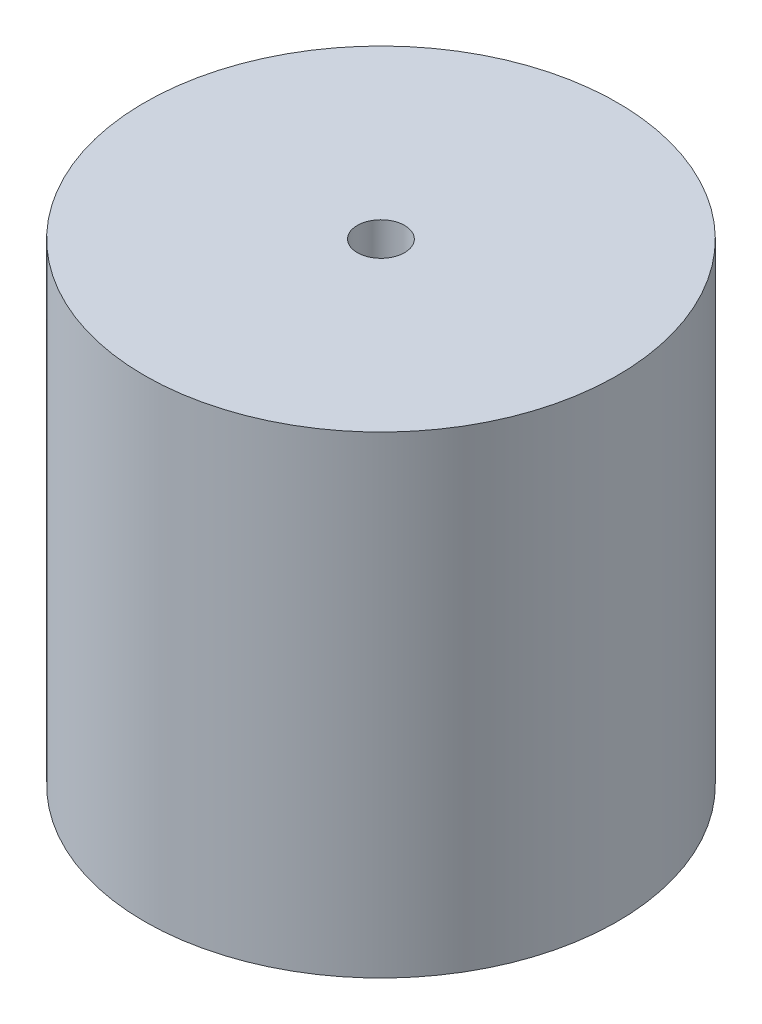
ISO-10303-21;
HEADER;
FILE_DESCRIPTION(('STEP AP214'),'2;1');
FILE_NAME('part.step','',(''),(''),'','','');
FILE_SCHEMA(('AUTOMOTIVE_DESIGN { 1 0 10303 214 1 1 1 1 }'));
ENDSEC;
DATA;
#1=APPLICATION_CONTEXT('core data for automotive mechanical design processes');
#2=APPLICATION_PROTOCOL_DEFINITION('international standard','automotive_design',2000,#1);
#3=PRODUCT_CONTEXT('',#1,'mechanical');
#4=PRODUCT('Part','Part','',(#3));
#5=PRODUCT_RELATED_PRODUCT_CATEGORY('part','',(#4));
#6=PRODUCT_DEFINITION_FORMATION('','',#4);
#7=PRODUCT_DEFINITION_CONTEXT('part definition',#1,'design');
#8=PRODUCT_DEFINITION('design','',#6,#7);
#9=PRODUCT_DEFINITION_SHAPE('','',#8);
#10=(LENGTH_UNIT() NAMED_UNIT(*) SI_UNIT(.MILLI.,.METRE.));
#11=(NAMED_UNIT(*) PLANE_ANGLE_UNIT() SI_UNIT($,.RADIAN.));
#12=(NAMED_UNIT(*) SI_UNIT($,.STERADIAN.) SOLID_ANGLE_UNIT());
#13=UNCERTAINTY_MEASURE_WITH_UNIT(LENGTH_MEASURE(1.E-05),#10,'distance_accuracy_value','');
#14=(GEOMETRIC_REPRESENTATION_CONTEXT(3) GLOBAL_UNCERTAINTY_ASSIGNED_CONTEXT((#13)) GLOBAL_UNIT_ASSIGNED_CONTEXT((#10,
#11,#12)) REPRESENTATION_CONTEXT('',''));
#15=CARTESIAN_POINT('',(0.,0.,0.));
#16=DIRECTION('',(0.,0.,1.));
#17=DIRECTION('',(1.,0.,0.));
#18=AXIS2_PLACEMENT_3D('',#15,#16,#17);
#19=CARTESIAN_POINT('',(0.,31.75,0.));
#20=DIRECTION('',(0.,-1.,0.));
#21=DIRECTION('',(0.,0.,-1.));
#22=AXIS2_PLACEMENT_3D('',#19,#20,#21);
#23=CYLINDRICAL_SURFACE('',#22,15.875);
#24=CARTESIAN_POINT('',(0.,31.75,0.));
#25=DIRECTION('',(0.,1.,0.));
#26=DIRECTION('',(0.,0.,1.));
#27=AXIS2_PLACEMENT_3D('',#24,#25,#26);
#28=CIRCLE('',#27,15.875);
#29=CARTESIAN_POINT('',(0.,31.75,15.875));
#30=VERTEX_POINT('',#29);
#31=EDGE_CURVE('E10',#30,#30,#28,.T.);
#32=ORIENTED_EDGE('',*,*,#31,.F.);
#33=EDGE_LOOP('',(#32));
#34=FACE_BOUND('',#33,.T.);
#35=CARTESIAN_POINT('',(0.,0.,0.));
#36=DIRECTION('',(0.,1.,0.));
#37=DIRECTION('',(0.,0.,1.));
#38=AXIS2_PLACEMENT_3D('',#35,#36,#37);
#39=CIRCLE('',#38,15.875);
#40=CARTESIAN_POINT('',(0.,0.,15.875));
#41=VERTEX_POINT('',#40);
#42=EDGE_CURVE('E34',#41,#41,#39,.T.);
#43=ORIENTED_EDGE('',*,*,#42,.T.);
#44=EDGE_LOOP('',(#43));
#45=FACE_BOUND('',#44,.T.);
#46=ADVANCED_FACE('F31',(#34,#45),#23,.T.);
#47=CARTESIAN_POINT('',(0.,31.75,0.));
#48=DIRECTION('',(0.,1.,0.));
#49=DIRECTION('',(0.,0.,1.));
#50=AXIS2_PLACEMENT_3D('',#47,#48,#49);
#51=PLANE('',#50);
#52=CARTESIAN_POINT('',(0.,31.75,0.));
#53=DIRECTION('',(0.,1.,0.));
#54=DIRECTION('',(0.,0.,1.));
#55=AXIS2_PLACEMENT_3D('',#52,#53,#54);
#56=CIRCLE('',#55,1.5875);
#57=CARTESIAN_POINT('',(0.,31.75,1.5875));
#58=VERTEX_POINT('',#57);
#59=EDGE_CURVE('E46',#58,#58,#56,.T.);
#60=ORIENTED_EDGE('',*,*,#59,.F.);
#61=EDGE_LOOP('',(#60));
#62=FACE_BOUND('',#61,.T.);
#63=ORIENTED_EDGE('',*,*,#31,.T.);
#64=EDGE_LOOP('',(#63));
#65=FACE_BOUND('',#64,.T.);
#66=ADVANCED_FACE('F57',(#62,#65),#51,.T.);
#67=CARTESIAN_POINT('',(0.,0.,0.));
#68=DIRECTION('',(0.,1.,0.));
#69=DIRECTION('',(0.,0.,1.));
#70=AXIS2_PLACEMENT_3D('',#67,#68,#69);
#71=PLANE('',#70);
#72=CARTESIAN_POINT('',(0.,0.,0.));
#73=DIRECTION('',(0.,-1.,0.));
#74=DIRECTION('',(0.,0.,-1.));
#75=AXIS2_PLACEMENT_3D('',#72,#73,#74);
#76=CIRCLE('',#75,12.065);
#77=CARTESIAN_POINT('',(0.,0.,-12.065));
#78=VERTEX_POINT('',#77);
#79=EDGE_CURVE('E43',#78,#78,#76,.T.);
#80=ORIENTED_EDGE('',*,*,#79,.F.);
#81=EDGE_LOOP('',(#80));
#82=FACE_BOUND('',#81,.T.);
#83=ORIENTED_EDGE('',*,*,#42,.F.);
#84=EDGE_LOOP('',(#83));
#85=FACE_BOUND('',#84,.T.);
#86=ADVANCED_FACE('F59',(#82,#85),#71,.F.);
#87=CARTESIAN_POINT('',(0.,24.13,0.));
#88=DIRECTION('',(0.,-1.,0.));
#89=DIRECTION('',(0.,0.,-1.));
#90=AXIS2_PLACEMENT_3D('',#87,#88,#89);
#91=CYLINDRICAL_SURFACE('',#90,12.065);
#92=CARTESIAN_POINT('',(0.,24.13,0.));
#93=DIRECTION('',(0.,-1.,0.));
#94=DIRECTION('',(0.,0.,-1.));
#95=AXIS2_PLACEMENT_3D('',#92,#93,#94);
#96=CIRCLE('',#95,12.065);
#97=CARTESIAN_POINT('',(0.,24.13,-12.065));
#98=VERTEX_POINT('',#97);
#99=EDGE_CURVE('E41',#98,#98,#96,.T.);
#100=CARTESIAN_POINT('',(0.,24.13,-12.065));
#101=CARTESIAN_POINT('',(0.,23.8786458333333,-12.065));
#102=CARTESIAN_POINT('',(0.,23.6272916666667,-12.065));
#103=CARTESIAN_POINT('',(0.,23.1245833333333,-12.065));
#104=CARTESIAN_POINT('',(0.,22.8732291666667,-12.065));
#105=CARTESIAN_POINT('',(0.,22.3705208333333,-12.065));
#106=CARTESIAN_POINT('',(0.,22.1191666666667,-12.065));
#107=CARTESIAN_POINT('',(0.,21.6164583333333,-12.065));
#108=CARTESIAN_POINT('',(0.,21.3651041666667,-12.065));
#109=CARTESIAN_POINT('',(0.,20.8623958333333,-12.065));
#110=CARTESIAN_POINT('',(0.,20.6110416666667,-12.065));
#111=CARTESIAN_POINT('',(0.,20.1083333333333,-12.065));
#112=CARTESIAN_POINT('',(0.,19.8569791666667,-12.065));
#113=CARTESIAN_POINT('',(0.,19.3542708333333,-12.065));
#114=CARTESIAN_POINT('',(0.,19.1029166666667,-12.065));
#115=CARTESIAN_POINT('',(0.,18.6002083333333,-12.065));
#116=CARTESIAN_POINT('',(0.,18.3488541666667,-12.065));
#117=CARTESIAN_POINT('',(0.,17.8461458333333,-12.065));
#118=CARTESIAN_POINT('',(0.,17.5947916666667,-12.065));
#119=CARTESIAN_POINT('',(0.,17.0920833333333,-12.065));
#120=CARTESIAN_POINT('',(0.,16.8407291666667,-12.065));
#121=CARTESIAN_POINT('',(0.,16.3380208333333,-12.065));
#122=CARTESIAN_POINT('',(0.,16.0866666666667,-12.065));
#123=CARTESIAN_POINT('',(0.,15.5839583333333,-12.065));
#124=CARTESIAN_POINT('',(0.,15.3326041666667,-12.065));
#125=CARTESIAN_POINT('',(0.,14.8298958333333,-12.065));
#126=CARTESIAN_POINT('',(0.,14.5785416666667,-12.065));
#127=CARTESIAN_POINT('',(0.,14.0758333333333,-12.065));
#128=CARTESIAN_POINT('',(0.,13.8244791666667,-12.065));
#129=CARTESIAN_POINT('',(0.,13.3217708333333,-12.065));
#130=CARTESIAN_POINT('',(0.,13.0704166666667,-12.065));
#131=CARTESIAN_POINT('',(0.,12.5677083333333,-12.065));
#132=CARTESIAN_POINT('',(0.,12.3163541666667,-12.065));
#133=CARTESIAN_POINT('',(0.,11.8136458333333,-12.065));
#134=CARTESIAN_POINT('',(0.,11.5622916666667,-12.065));
#135=CARTESIAN_POINT('',(0.,11.0595833333333,-12.065));
#136=CARTESIAN_POINT('',(0.,10.8082291666667,-12.065));
#137=CARTESIAN_POINT('',(0.,10.3055208333333,-12.065));
#138=CARTESIAN_POINT('',(0.,10.0541666666667,-12.065));
#139=CARTESIAN_POINT('',(0.,9.55145833333333,-12.065));
#140=CARTESIAN_POINT('',(0.,9.30010416666667,-12.065));
#141=CARTESIAN_POINT('',(0.,8.79739583333334,-12.065));
#142=CARTESIAN_POINT('',(0.,8.54604166666667,-12.065));
#143=CARTESIAN_POINT('',(0.,8.04333333333334,-12.065));
#144=CARTESIAN_POINT('',(0.,7.79197916666667,-12.065));
#145=CARTESIAN_POINT('',(0.,7.28927083333334,-12.065));
#146=CARTESIAN_POINT('',(0.,7.03791666666667,-12.065));
#147=CARTESIAN_POINT('',(0.,6.53520833333334,-12.065));
#148=CARTESIAN_POINT('',(0.,6.28385416666667,-12.065));
#149=CARTESIAN_POINT('',(0.,5.78114583333334,-12.065));
#150=CARTESIAN_POINT('',(0.,5.52979166666667,-12.065));
#151=CARTESIAN_POINT('',(0.,5.02708333333334,-12.065));
#152=CARTESIAN_POINT('',(0.,4.77572916666667,-12.065));
#153=CARTESIAN_POINT('',(0.,4.27302083333334,-12.065));
#154=CARTESIAN_POINT('',(0.,4.02166666666667,-12.065));
#155=CARTESIAN_POINT('',(0.,3.51895833333334,-12.065));
#156=CARTESIAN_POINT('',(0.,3.26760416666667,-12.065));
#157=CARTESIAN_POINT('',(0.,2.76489583333334,-12.065));
#158=CARTESIAN_POINT('',(0.,2.51354166666667,-12.065));
#159=CARTESIAN_POINT('',(0.,2.01083333333334,-12.065));
#160=CARTESIAN_POINT('',(0.,1.75947916666667,-12.065));
#161=CARTESIAN_POINT('',(0.,1.25677083333334,-12.065));
#162=CARTESIAN_POINT('',(0.,1.00541666666667,-12.065));
#163=CARTESIAN_POINT('',(0.,0.502708333333336,-12.065));
#164=CARTESIAN_POINT('',(0.,0.25135416666667,-12.065));
#165=CARTESIAN_POINT('',(0.,0.,-12.065));
#166=B_SPLINE_CURVE_WITH_KNOTS('',3,(#100,#101,#102,#103,#104,#105,#106,#107,#108,#109,#110,
#111,#112,#113,#114,#115,#116,#117,#118,#119,#120,#121,#122,#123,#124,#125,#126,#127,#128,#129,
#130,#131,#132,#133,#134,#135,#136,#137,#138,#139,#140,#141,#142,#143,#144,#145,#146,#147,#148,
#149,#150,#151,#152,#153,#154,#155,#156,#157,#158,#159,#160,#161,#162,#163,#164,#165),
.UNSPECIFIED.,.F.,.F.,(4,2,2,2,2,2,2,2,2,2,2,2,2,2,2,2,2,2,2,2,2,2,2,2,2,2,2,2,2,2,2,2,4),(0.,
0.754062500000003,1.508125,2.2621875,3.01625,3.7703125,4.524375,5.2784375,6.0325,6.7865625,
7.540625,8.2946875,9.04875,9.8028125,10.556875,11.3109375,12.065,12.8190625,13.573125,
14.3271875,15.08125,15.8353125,16.589375,17.3434375,18.0975,18.8515625,19.605625,20.3596875,
21.11375,21.8678125,22.621875,23.3759375,24.13),.UNSPECIFIED.);
#167=EDGE_CURVE('BSEAM66',#98,#78,#166,.T.);
#168=ORIENTED_EDGE('',*,*,#99,.F.);
#169=ORIENTED_EDGE('',*,*,#79,.T.);
#170=ORIENTED_EDGE('',*,*,#167,.T.);
#171=ORIENTED_EDGE('',*,*,#167,.F.);
#172=EDGE_LOOP('',(#168,#170,#169,#171));
#173=FACE_BOUND('',#172,.T.);
#174=ADVANCED_FACE('F66',(#173),#91,.F.);
#175=CARTESIAN_POINT('',(0.,24.13,0.));
#176=DIRECTION('',(0.,-1.,0.));
#177=DIRECTION('',(0.,0.,-1.));
#178=AXIS2_PLACEMENT_3D('',#175,#176,#177);
#179=PLANE('',#178);
#180=CARTESIAN_POINT('',(0.,24.13,0.));
#181=DIRECTION('',(0.,-1.,0.));
#182=DIRECTION('',(0.,0.,-1.));
#183=AXIS2_PLACEMENT_3D('',#180,#181,#182);
#184=CIRCLE('',#183,1.5875);
#185=CARTESIAN_POINT('',(0.,24.13,-1.5875));
#186=VERTEX_POINT('',#185);
#187=EDGE_CURVE('E49',#186,#186,#184,.F.);
#188=ORIENTED_EDGE('',*,*,#187,.T.);
#189=EDGE_LOOP('',(#188));
#190=FACE_BOUND('',#189,.T.);
#191=ORIENTED_EDGE('',*,*,#99,.T.);
#192=EDGE_LOOP('',(#191));
#193=FACE_BOUND('',#192,.T.);
#194=ADVANCED_FACE('F73',(#190,#193),#179,.T.);
#195=CARTESIAN_POINT('',(0.,-0.001000000000001,0.));
#196=DIRECTION('',(0.,1.,0.));
#197=DIRECTION('',(0.,0.,1.));
#198=AXIS2_PLACEMENT_3D('',#195,#196,#197);
#199=CYLINDRICAL_SURFACE('',#198,1.5875);
#200=ORIENTED_EDGE('',*,*,#187,.F.);
#201=EDGE_LOOP('',(#200));
#202=FACE_BOUND('',#201,.T.);
#203=ORIENTED_EDGE('',*,*,#59,.T.);
#204=EDGE_LOOP('',(#203));
#205=FACE_BOUND('',#204,.T.);
#206=ADVANCED_FACE('F55',(#202,#205),#199,.F.);
#207=CLOSED_SHELL('',(#46,#66,#86,#174,#194,#206));
#208=MANIFOLD_SOLID_BREP('B2',#207);
#209=ADVANCED_BREP_SHAPE_REPRESENTATION('',(#18,#208),#14);
#210=SHAPE_DEFINITION_REPRESENTATION(#9,#209);
ENDSEC;
END-ISO-10303-21;
